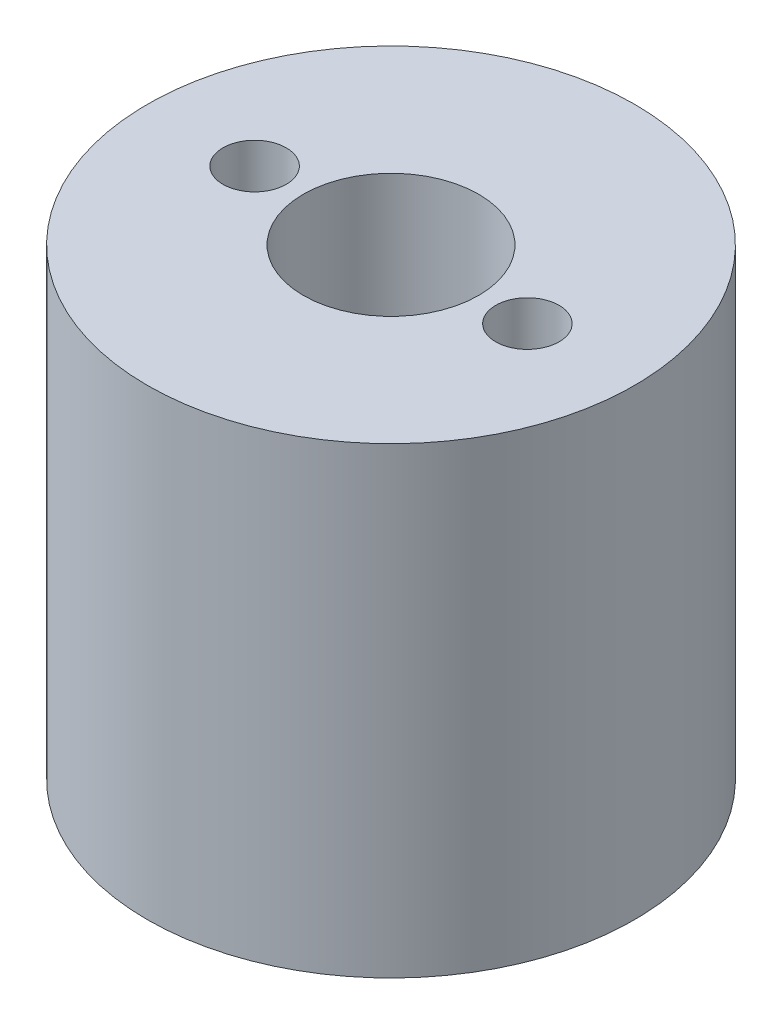
ISO-10303-21;
HEADER;
FILE_DESCRIPTION(('STEP AP214'),'2;1');
FILE_NAME('part.step','',(''),(''),'','','');
FILE_SCHEMA(('AUTOMOTIVE_DESIGN { 1 0 10303 214 1 1 1 1 }'));
ENDSEC;
DATA;
#1=APPLICATION_CONTEXT('core data for automotive mechanical design processes');
#2=APPLICATION_PROTOCOL_DEFINITION('international standard','automotive_design',2000,#1);
#3=PRODUCT_CONTEXT('',#1,'mechanical');
#4=PRODUCT('Part','Part','',(#3));
#5=PRODUCT_RELATED_PRODUCT_CATEGORY('part','',(#4));
#6=PRODUCT_DEFINITION_FORMATION('','',#4);
#7=PRODUCT_DEFINITION_CONTEXT('part definition',#1,'design');
#8=PRODUCT_DEFINITION('design','',#6,#7);
#9=PRODUCT_DEFINITION_SHAPE('','',#8);
#10=(LENGTH_UNIT() NAMED_UNIT(*) SI_UNIT(.MILLI.,.METRE.));
#11=(NAMED_UNIT(*) PLANE_ANGLE_UNIT() SI_UNIT($,.RADIAN.));
#12=(NAMED_UNIT(*) SI_UNIT($,.STERADIAN.) SOLID_ANGLE_UNIT());
#13=UNCERTAINTY_MEASURE_WITH_UNIT(LENGTH_MEASURE(1.E-05),#10,'distance_accuracy_value','');
#14=(GEOMETRIC_REPRESENTATION_CONTEXT(3) GLOBAL_UNCERTAINTY_ASSIGNED_CONTEXT((#13)) GLOBAL_UNIT_ASSIGNED_CONTEXT((#10,
#11,#12)) REPRESENTATION_CONTEXT('',''));
#15=CARTESIAN_POINT('',(0.,0.,0.));
#16=DIRECTION('',(0.,0.,1.));
#17=DIRECTION('',(1.,0.,0.));
#18=AXIS2_PLACEMENT_3D('',#15,#16,#17);
#19=CARTESIAN_POINT('',(0.,5.,0.));
#20=DIRECTION('',(0.,1.,0.));
#21=DIRECTION('',(0.,0.,-1.));
#22=AXIS2_PLACEMENT_3D('',#19,#20,#21);
#23=PLANE('',#22);
#24=CARTESIAN_POINT('',(0.,5.,0.));
#25=DIRECTION('',(0.,-1.,0.));
#26=DIRECTION('',(0.,0.,-1.));
#27=AXIS2_PLACEMENT_3D('',#24,#25,#26);
#28=CIRCLE('',#27,2.1);
#29=CARTESIAN_POINT('',(0.,5.,-2.1));
#30=VERTEX_POINT('',#29);
#31=EDGE_CURVE('E42',#30,#30,#28,.T.);
#32=ORIENTED_EDGE('',*,*,#31,.T.);
#33=EDGE_LOOP('',(#32));
#34=FACE_BOUND('',#33,.T.);
#35=CARTESIAN_POINT('',(0.,5.,0.));
#36=DIRECTION('',(0.,-1.,0.));
#37=DIRECTION('',(0.,0.,-1.));
#38=AXIS2_PLACEMENT_3D('',#35,#36,#37);
#39=CIRCLE('',#38,3.6);
#40=CARTESIAN_POINT('',(0.,5.,-3.6));
#41=VERTEX_POINT('',#40);
#42=EDGE_CURVE('E56',#41,#41,#39,.T.);
#43=ORIENTED_EDGE('',*,*,#42,.F.);
#44=EDGE_LOOP('',(#43));
#45=FACE_BOUND('',#44,.T.);
#46=ADVANCED_FACE('F35',(#34,#45),#23,.T.);
#47=CARTESIAN_POINT('',(0.,0.,0.));
#48=DIRECTION('',(0.,1.,0.));
#49=DIRECTION('',(0.,0.,-1.));
#50=AXIS2_PLACEMENT_3D('',#47,#48,#49);
#51=PLANE('',#50);
#52=CARTESIAN_POINT('',(-5.6,0.,0.));
#53=DIRECTION('',(0.,-1.,0.));
#54=DIRECTION('',(0.,0.,-1.));
#55=AXIS2_PLACEMENT_3D('',#52,#53,#54);
#56=CIRCLE('',#55,1.3);
#57=CARTESIAN_POINT('',(-5.6,0.,-1.3));
#58=VERTEX_POINT('',#57);
#59=EDGE_CURVE('E59',#58,#58,#56,.T.);
#60=ORIENTED_EDGE('',*,*,#59,.F.);
#61=EDGE_LOOP('',(#60));
#62=FACE_BOUND('',#61,.T.);
#63=CARTESIAN_POINT('',(5.6,0.,0.));
#64=DIRECTION('',(0.,-1.,0.));
#65=DIRECTION('',(0.,0.,-1.));
#66=AXIS2_PLACEMENT_3D('',#63,#64,#65);
#67=CIRCLE('',#66,1.3);
#68=CARTESIAN_POINT('',(5.6,0.,-1.3));
#69=VERTEX_POINT('',#68);
#70=EDGE_CURVE('E65',#69,#69,#67,.T.);
#71=ORIENTED_EDGE('',*,*,#70,.F.);
#72=EDGE_LOOP('',(#71));
#73=FACE_BOUND('',#72,.T.);
#74=CARTESIAN_POINT('',(0.,0.,0.));
#75=DIRECTION('',(0.,-1.,0.));
#76=DIRECTION('',(0.,0.,-1.));
#77=AXIS2_PLACEMENT_3D('',#74,#75,#76);
#78=CIRCLE('',#77,10.);
#79=CARTESIAN_POINT('',(0.,0.,-10.));
#80=VERTEX_POINT('',#79);
#81=EDGE_CURVE('E10',#80,#80,#78,.T.);
#82=ORIENTED_EDGE('',*,*,#81,.T.);
#83=EDGE_LOOP('',(#82));
#84=FACE_BOUND('',#83,.T.);
#85=CARTESIAN_POINT('',(0.,0.,0.));
#86=DIRECTION('',(0.,-1.,0.));
#87=DIRECTION('',(0.,0.,-1.));
#88=AXIS2_PLACEMENT_3D('',#85,#86,#87);
#89=CIRCLE('',#88,2.1);
#90=CARTESIAN_POINT('',(0.,0.,-2.1));
#91=VERTEX_POINT('',#90);
#92=EDGE_CURVE('E46',#91,#91,#89,.T.);
#93=ORIENTED_EDGE('',*,*,#92,.F.);
#94=EDGE_LOOP('',(#93));
#95=FACE_BOUND('',#94,.T.);
#96=ADVANCED_FACE('F77',(#62,#73,#84,#95),#51,.F.);
#97=CARTESIAN_POINT('',(0.,5.,0.));
#98=DIRECTION('',(0.,-1.,0.));
#99=DIRECTION('',(0.,0.,1.));
#100=AXIS2_PLACEMENT_3D('',#97,#98,#99);
#101=CYLINDRICAL_SURFACE('',#100,10.);
#102=ORIENTED_EDGE('',*,*,#81,.F.);
#103=EDGE_LOOP('',(#102));
#104=FACE_BOUND('',#103,.T.);
#105=CARTESIAN_POINT('',(0.,19.,0.));
#106=DIRECTION('',(0.,-1.,0.));
#107=DIRECTION('',(0.,0.,-1.));
#108=AXIS2_PLACEMENT_3D('',#105,#106,#107);
#109=CIRCLE('',#108,10.);
#110=CARTESIAN_POINT('',(0.,19.,-10.));
#111=VERTEX_POINT('',#110);
#112=EDGE_CURVE('E51',#111,#111,#109,.T.);
#113=ORIENTED_EDGE('',*,*,#112,.T.);
#114=EDGE_LOOP('',(#113));
#115=FACE_BOUND('',#114,.T.);
#116=ADVANCED_FACE('F37',(#104,#115),#101,.T.);
#117=CARTESIAN_POINT('',(0.,5.,0.));
#118=DIRECTION('',(0.,-1.,0.));
#119=DIRECTION('',(0.,0.,1.));
#120=AXIS2_PLACEMENT_3D('',#117,#118,#119);
#121=CYLINDRICAL_SURFACE('',#120,2.1);
#122=ORIENTED_EDGE('',*,*,#31,.F.);
#123=EDGE_LOOP('',(#122));
#124=FACE_BOUND('',#123,.T.);
#125=ORIENTED_EDGE('',*,*,#92,.T.);
#126=EDGE_LOOP('',(#125));
#127=FACE_BOUND('',#126,.T.);
#128=ADVANCED_FACE('F84',(#124,#127),#121,.F.);
#129=CARTESIAN_POINT('',(0.,19.,0.));
#130=DIRECTION('',(0.,1.,0.));
#131=DIRECTION('',(0.,0.,-1.));
#132=AXIS2_PLACEMENT_3D('',#129,#130,#131);
#133=PLANE('',#132);
#134=CARTESIAN_POINT('',(-5.6,19.,0.));
#135=DIRECTION('',(0.,-1.,0.));
#136=DIRECTION('',(0.,0.,-1.));
#137=AXIS2_PLACEMENT_3D('',#134,#135,#136);
#138=CIRCLE('',#137,1.3);
#139=CARTESIAN_POINT('',(-5.6,19.,-1.3));
#140=VERTEX_POINT('',#139);
#141=EDGE_CURVE('E68',#140,#140,#138,.T.);
#142=ORIENTED_EDGE('',*,*,#141,.T.);
#143=EDGE_LOOP('',(#142));
#144=FACE_BOUND('',#143,.T.);
#145=CARTESIAN_POINT('',(5.6,19.,0.));
#146=DIRECTION('',(0.,-1.,0.));
#147=DIRECTION('',(0.,0.,-1.));
#148=AXIS2_PLACEMENT_3D('',#145,#146,#147);
#149=CIRCLE('',#148,1.3);
#150=CARTESIAN_POINT('',(5.6,19.,-1.3));
#151=VERTEX_POINT('',#150);
#152=EDGE_CURVE('E62',#151,#151,#149,.T.);
#153=ORIENTED_EDGE('',*,*,#152,.T.);
#154=EDGE_LOOP('',(#153));
#155=FACE_BOUND('',#154,.T.);
#156=ORIENTED_EDGE('',*,*,#112,.F.);
#157=EDGE_LOOP('',(#156));
#158=FACE_BOUND('',#157,.T.);
#159=CARTESIAN_POINT('',(0.,19.,0.));
#160=DIRECTION('',(0.,-1.,0.));
#161=DIRECTION('',(0.,0.,-1.));
#162=AXIS2_PLACEMENT_3D('',#159,#160,#161);
#163=CIRCLE('',#162,3.6);
#164=CARTESIAN_POINT('',(0.,19.,-3.6));
#165=VERTEX_POINT('',#164);
#166=EDGE_CURVE('E55',#165,#165,#163,.T.);
#167=ORIENTED_EDGE('',*,*,#166,.T.);
#168=EDGE_LOOP('',(#167));
#169=FACE_BOUND('',#168,.T.);
#170=ADVANCED_FACE('F86',(#144,#155,#158,#169),#133,.T.);
#171=CARTESIAN_POINT('',(0.,19.,0.));
#172=DIRECTION('',(0.,-1.,0.));
#173=DIRECTION('',(0.,0.,1.));
#174=AXIS2_PLACEMENT_3D('',#171,#172,#173);
#175=CYLINDRICAL_SURFACE('',#174,3.6);
#176=ORIENTED_EDGE('',*,*,#166,.F.);
#177=EDGE_LOOP('',(#176));
#178=FACE_BOUND('',#177,.T.);
#179=ORIENTED_EDGE('',*,*,#42,.T.);
#180=EDGE_LOOP('',(#179));
#181=FACE_BOUND('',#180,.T.);
#182=ADVANCED_FACE('F93',(#178,#181),#175,.F.);
#183=CARTESIAN_POINT('',(5.6,0.,0.));
#184=DIRECTION('',(0.,1.,0.));
#185=DIRECTION('',(0.,0.,-1.));
#186=AXIS2_PLACEMENT_3D('',#183,#184,#185);
#187=CYLINDRICAL_SURFACE('',#186,1.3);
#188=ORIENTED_EDGE('',*,*,#70,.T.);
#189=EDGE_LOOP('',(#188));
#190=FACE_BOUND('',#189,.T.);
#191=ORIENTED_EDGE('',*,*,#152,.F.);
#192=EDGE_LOOP('',(#191));
#193=FACE_BOUND('',#192,.T.);
#194=ADVANCED_FACE('F105',(#190,#193),#187,.F.);
#195=CARTESIAN_POINT('',(-5.6,0.,0.));
#196=DIRECTION('',(0.,1.,0.));
#197=DIRECTION('',(0.,0.,-1.));
#198=AXIS2_PLACEMENT_3D('',#195,#196,#197);
#199=CYLINDRICAL_SURFACE('',#198,1.3);
#200=ORIENTED_EDGE('',*,*,#59,.T.);
#201=EDGE_LOOP('',(#200));
#202=FACE_BOUND('',#201,.T.);
#203=ORIENTED_EDGE('',*,*,#141,.F.);
#204=EDGE_LOOP('',(#203));
#205=FACE_BOUND('',#204,.T.);
#206=ADVANCED_FACE('F74',(#202,#205),#199,.F.);
#207=CLOSED_SHELL('',(#46,#96,#116,#128,#170,#182,#194,#206));
#208=MANIFOLD_SOLID_BREP('B2',#207);
#209=ADVANCED_BREP_SHAPE_REPRESENTATION('',(#18,#208),#14);
#210=SHAPE_DEFINITION_REPRESENTATION(#9,#209);
ENDSEC;
END-ISO-10303-21;
